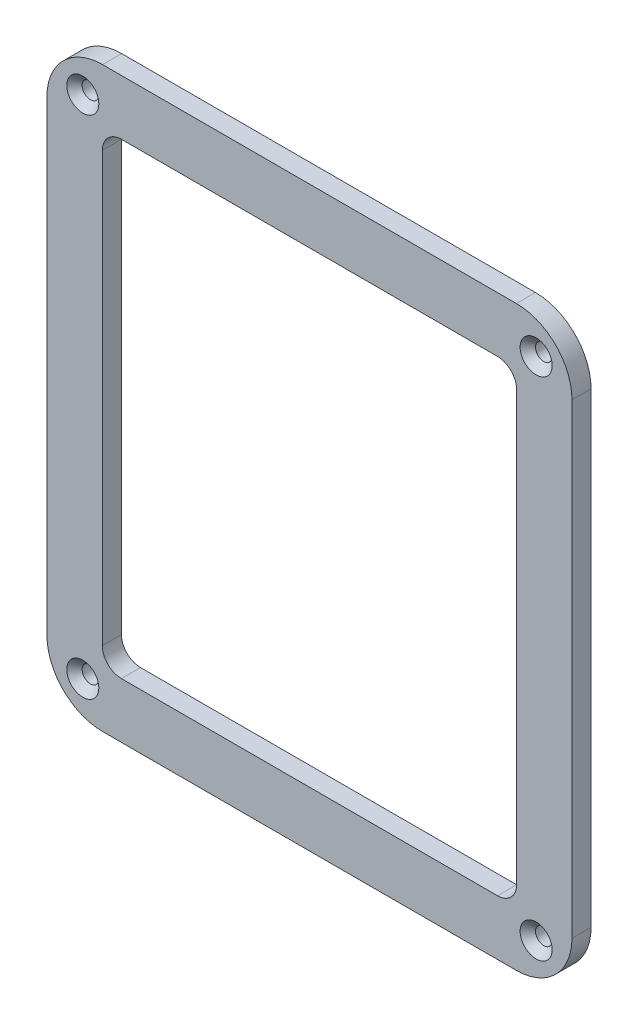
ISO-10303-21;
HEADER;
FILE_DESCRIPTION(('STEP AP214'),'2;1');
FILE_NAME('part.step','',(''),(''),'','','');
FILE_SCHEMA(('AUTOMOTIVE_DESIGN { 1 0 10303 214 1 1 1 1 }'));
ENDSEC;
DATA;
#1=APPLICATION_CONTEXT('core data for automotive mechanical design processes');
#2=APPLICATION_PROTOCOL_DEFINITION('international standard','automotive_design',2000,#1);
#3=PRODUCT_CONTEXT('',#1,'mechanical');
#4=PRODUCT('Part','Part','',(#3));
#5=PRODUCT_RELATED_PRODUCT_CATEGORY('part','',(#4));
#6=PRODUCT_DEFINITION_FORMATION('','',#4);
#7=PRODUCT_DEFINITION_CONTEXT('part definition',#1,'design');
#8=PRODUCT_DEFINITION('design','',#6,#7);
#9=PRODUCT_DEFINITION_SHAPE('','',#8);
#10=(LENGTH_UNIT() NAMED_UNIT(*) SI_UNIT(.MILLI.,.METRE.));
#11=(NAMED_UNIT(*) PLANE_ANGLE_UNIT() SI_UNIT($,.RADIAN.));
#12=(NAMED_UNIT(*) SI_UNIT($,.STERADIAN.) SOLID_ANGLE_UNIT());
#13=UNCERTAINTY_MEASURE_WITH_UNIT(LENGTH_MEASURE(1.E-05),#10,'distance_accuracy_value','');
#14=(GEOMETRIC_REPRESENTATION_CONTEXT(3) GLOBAL_UNCERTAINTY_ASSIGNED_CONTEXT((#13)) GLOBAL_UNIT_ASSIGNED_CONTEXT((#10,
#11,#12)) REPRESENTATION_CONTEXT('',''));
#15=CARTESIAN_POINT('',(0.,0.,0.));
#16=DIRECTION('',(0.,0.,1.));
#17=DIRECTION('',(1.,0.,0.));
#18=AXIS2_PLACEMENT_3D('',#15,#16,#17);
#19=CARTESIAN_POINT('',(43.35,48.85,4.));
#20=DIRECTION('',(0.,0.,1.));
#21=DIRECTION('',(1.,0.,0.));
#22=AXIS2_PLACEMENT_3D('',#19,#20,#21);
#23=PLANE('',#22);
#24=CARTESIAN_POINT('',(-47.4884406486747,-52.9884406486746,4.));
#25=DIRECTION('',(0.,0.,1.));
#26=DIRECTION('',(1.,0.,0.));
#27=AXIS2_PLACEMENT_3D('',#24,#25,#26);
#28=CIRCLE('',#27,3.36);
#29=CARTESIAN_POINT('',(-44.1284406486747,-52.9884406486746,4.));
#30=VERTEX_POINT('',#29);
#31=EDGE_CURVE('E665',#30,#30,#28,.T.);
#32=ORIENTED_EDGE('',*,*,#31,.F.);
#33=EDGE_LOOP('',(#32));
#34=FACE_BOUND('',#33,.T.);
#35=CARTESIAN_POINT('',(47.4884406486747,-52.9884406486746,4.));
#36=DIRECTION('',(0.,0.,1.));
#37=DIRECTION('',(1.,0.,0.));
#38=AXIS2_PLACEMENT_3D('',#35,#36,#37);
#39=CIRCLE('',#38,3.36);
#40=CARTESIAN_POINT('',(50.8484406486747,-52.9884406486746,4.));
#41=VERTEX_POINT('',#40);
#42=EDGE_CURVE('E442',#41,#41,#39,.T.);
#43=ORIENTED_EDGE('',*,*,#42,.F.);
#44=EDGE_LOOP('',(#43));
#45=FACE_BOUND('',#44,.T.);
#46=CARTESIAN_POINT('',(47.4884406486747,52.9884406486746,4.));
#47=DIRECTION('',(0.,0.,1.));
#48=DIRECTION('',(1.,0.,0.));
#49=AXIS2_PLACEMENT_3D('',#46,#47,#48);
#50=CIRCLE('',#49,3.36);
#51=CARTESIAN_POINT('',(50.8484406486747,52.9884406486746,4.));
#52=VERTEX_POINT('',#51);
#53=EDGE_CURVE('E432',#52,#52,#50,.T.);
#54=ORIENTED_EDGE('',*,*,#53,.F.);
#55=EDGE_LOOP('',(#54));
#56=FACE_BOUND('',#55,.T.);
#57=CARTESIAN_POINT('',(-47.4884406486747,52.9884406486746,4.));
#58=DIRECTION('',(0.,0.,1.));
#59=DIRECTION('',(1.,0.,0.));
#60=AXIS2_PLACEMENT_3D('',#57,#58,#59);
#61=CIRCLE('',#60,3.36);
#62=CARTESIAN_POINT('',(-44.1284406486747,52.9884406486746,4.));
#63=VERTEX_POINT('',#62);
#64=EDGE_CURVE('E429',#63,#63,#61,.T.);
#65=ORIENTED_EDGE('',*,*,#64,.F.);
#66=EDGE_LOOP('',(#65));
#67=FACE_BOUND('',#66,.T.);
#68=CARTESIAN_POINT('',(43.35,48.85,4.));
#69=DIRECTION('',(0.,0.,1.));
#70=DIRECTION('',(1.,0.,0.));
#71=AXIS2_PLACEMENT_3D('',#68,#69,#70);
#72=CIRCLE('',#71,11.65);
#73=CARTESIAN_POINT('',(55.,48.85,4.));
#74=VERTEX_POINT('',#73);
#75=CARTESIAN_POINT('',(43.35,60.5,4.));
#76=VERTEX_POINT('',#75);
#77=EDGE_CURVE('E373',#74,#76,#72,.T.);
#78=ORIENTED_EDGE('',*,*,#77,.T.);
#79=DIRECTION('',(-1.,0.,0.));
#80=VECTOR('',#79,1.);
#81=CARTESIAN_POINT('',(43.35,60.5,4.));
#82=LINE('',#81,#80);
#83=CARTESIAN_POINT('',(-43.35,60.5,4.));
#84=VERTEX_POINT('',#83);
#85=EDGE_CURVE('E376',#76,#84,#82,.T.);
#86=ORIENTED_EDGE('',*,*,#85,.T.);
#87=CARTESIAN_POINT('',(-43.35,48.85,4.));
#88=DIRECTION('',(0.,0.,1.));
#89=DIRECTION('',(1.,0.,0.));
#90=AXIS2_PLACEMENT_3D('',#87,#88,#89);
#91=CIRCLE('',#90,11.65);
#92=CARTESIAN_POINT('',(-55.,48.85,4.));
#93=VERTEX_POINT('',#92);
#94=EDGE_CURVE('E379',#84,#93,#91,.T.);
#95=ORIENTED_EDGE('',*,*,#94,.T.);
#96=DIRECTION('',(0.,-1.,0.));
#97=VECTOR('',#96,1.);
#98=CARTESIAN_POINT('',(-55.,-48.85,4.));
#99=LINE('',#98,#97);
#100=CARTESIAN_POINT('',(-55.,-48.85,4.));
#101=VERTEX_POINT('',#100);
#102=EDGE_CURVE('E381',#93,#101,#99,.T.);
#103=ORIENTED_EDGE('',*,*,#102,.T.);
#104=CARTESIAN_POINT('',(-43.35,-48.85,4.));
#105=DIRECTION('',(0.,0.,1.));
#106=DIRECTION('',(-1.,0.,0.));
#107=AXIS2_PLACEMENT_3D('',#104,#105,#106);
#108=CIRCLE('',#107,11.65);
#109=CARTESIAN_POINT('',(-43.35,-60.5,4.));
#110=VERTEX_POINT('',#109);
#111=EDGE_CURVE('E383',#101,#110,#108,.T.);
#112=ORIENTED_EDGE('',*,*,#111,.T.);
#113=DIRECTION('',(1.,0.,0.));
#114=VECTOR('',#113,1.);
#115=CARTESIAN_POINT('',(43.35,-60.5,4.));
#116=LINE('',#115,#114);
#117=CARTESIAN_POINT('',(43.35,-60.5,4.));
#118=VERTEX_POINT('',#117);
#119=EDGE_CURVE('E385',#110,#118,#116,.T.);
#120=ORIENTED_EDGE('',*,*,#119,.T.);
#121=CARTESIAN_POINT('',(43.35,-48.85,4.));
#122=DIRECTION('',(0.,0.,1.));
#123=DIRECTION('',(1.,0.,0.));
#124=AXIS2_PLACEMENT_3D('',#121,#122,#123);
#125=CIRCLE('',#124,11.65);
#126=CARTESIAN_POINT('',(55.,-48.85,4.));
#127=VERTEX_POINT('',#126);
#128=EDGE_CURVE('E387',#118,#127,#125,.T.);
#129=ORIENTED_EDGE('',*,*,#128,.T.);
#130=DIRECTION('',(0.,1.,0.));
#131=VECTOR('',#130,1.);
#132=CARTESIAN_POINT('',(55.,-48.85,4.));
#133=LINE('',#132,#131);
#134=EDGE_CURVE('E389',#127,#74,#133,.T.);
#135=ORIENTED_EDGE('',*,*,#134,.T.);
#136=EDGE_LOOP('',(#78,#86,#95,#103,#112,#120,#129,#135));
#137=FACE_BOUND('',#136,.T.);
#138=DIRECTION('',(-1.,0.,0.));
#139=VECTOR('',#138,1.);
#140=CARTESIAN_POINT('',(39.4,48.925,4.));
#141=LINE('',#140,#139);
#142=CARTESIAN_POINT('',(39.4,48.925,4.));
#143=VERTEX_POINT('',#142);
#144=CARTESIAN_POINT('',(-39.4,48.925,4.));
#145=VERTEX_POINT('',#144);
#146=EDGE_CURVE('E314',#143,#145,#141,.T.);
#147=ORIENTED_EDGE('',*,*,#146,.F.);
#148=CARTESIAN_POINT('',(39.4,44.925,4.));
#149=DIRECTION('',(0.,0.,1.));
#150=DIRECTION('',(1.,0.,0.));
#151=AXIS2_PLACEMENT_3D('',#148,#149,#150);
#152=CIRCLE('',#151,4.);
#153=CARTESIAN_POINT('',(43.4,44.925,4.));
#154=VERTEX_POINT('',#153);
#155=EDGE_CURVE('E306',#154,#143,#152,.T.);
#156=ORIENTED_EDGE('',*,*,#155,.F.);
#157=DIRECTION('',(0.,1.,0.));
#158=VECTOR('',#157,1.);
#159=CARTESIAN_POINT('',(43.4,-44.925,4.));
#160=LINE('',#159,#158);
#161=CARTESIAN_POINT('',(43.4,-44.925,4.));
#162=VERTEX_POINT('',#161);
#163=EDGE_CURVE('E340',#162,#154,#160,.T.);
#164=ORIENTED_EDGE('',*,*,#163,.F.);
#165=CARTESIAN_POINT('',(39.4,-44.925,4.));
#166=DIRECTION('',(0.,0.,1.));
#167=DIRECTION('',(1.,0.,0.));
#168=AXIS2_PLACEMENT_3D('',#165,#166,#167);
#169=CIRCLE('',#168,4.);
#170=CARTESIAN_POINT('',(39.4,-48.925,4.));
#171=VERTEX_POINT('',#170);
#172=EDGE_CURVE('E338',#171,#162,#169,.T.);
#173=ORIENTED_EDGE('',*,*,#172,.F.);
#174=DIRECTION('',(1.,0.,0.));
#175=VECTOR('',#174,1.);
#176=CARTESIAN_POINT('',(39.4,-48.925,4.));
#177=LINE('',#176,#175);
#178=CARTESIAN_POINT('',(-39.4,-48.925,4.));
#179=VERTEX_POINT('',#178);
#180=EDGE_CURVE('E336',#179,#171,#177,.T.);
#181=ORIENTED_EDGE('',*,*,#180,.F.);
#182=CARTESIAN_POINT('',(-39.4,-44.925,4.));
#183=DIRECTION('',(0.,0.,1.));
#184=DIRECTION('',(-1.,0.,0.));
#185=AXIS2_PLACEMENT_3D('',#182,#183,#184);
#186=CIRCLE('',#185,3.99999999999999);
#187=CARTESIAN_POINT('',(-43.4,-44.925,4.));
#188=VERTEX_POINT('',#187);
#189=EDGE_CURVE('E334',#188,#179,#186,.T.);
#190=ORIENTED_EDGE('',*,*,#189,.F.);
#191=DIRECTION('',(0.,-1.,0.));
#192=VECTOR('',#191,1.);
#193=CARTESIAN_POINT('',(-43.4,-44.925,4.));
#194=LINE('',#193,#192);
#195=CARTESIAN_POINT('',(-43.4,44.925,4.));
#196=VERTEX_POINT('',#195);
#197=EDGE_CURVE('E329',#196,#188,#194,.T.);
#198=ORIENTED_EDGE('',*,*,#197,.F.);
#199=CARTESIAN_POINT('',(-39.4,44.925,4.));
#200=DIRECTION('',(0.,0.,1.));
#201=DIRECTION('',(1.,0.,0.));
#202=AXIS2_PLACEMENT_3D('',#199,#200,#201);
#203=CIRCLE('',#202,4.);
#204=EDGE_CURVE('E327',#145,#196,#203,.T.);
#205=ORIENTED_EDGE('',*,*,#204,.F.);
#206=EDGE_LOOP('',(#147,#156,#164,#173,#181,#190,#198,#205));
#207=FACE_BOUND('',#206,.T.);
#208=ADVANCED_FACE('F191',(#34,#45,#56,#67,#137,#207),#23,.T.);
#209=CARTESIAN_POINT('',(43.35,48.85,0.));
#210=DIRECTION('',(0.,0.,1.));
#211=DIRECTION('',(1.,0.,0.));
#212=AXIS2_PLACEMENT_3D('',#209,#210,#211);
#213=PLANE('',#212);
#214=CARTESIAN_POINT('',(43.35,48.85,0.));
#215=DIRECTION('',(0.,0.,1.));
#216=DIRECTION('',(1.,0.,0.));
#217=AXIS2_PLACEMENT_3D('',#214,#215,#216);
#218=CIRCLE('',#217,11.65);
#219=CARTESIAN_POINT('',(55.,48.85,0.));
#220=VERTEX_POINT('',#219);
#221=CARTESIAN_POINT('',(43.35,60.5,0.));
#222=VERTEX_POINT('',#221);
#223=EDGE_CURVE('E322',#220,#222,#218,.T.);
#224=ORIENTED_EDGE('',*,*,#223,.F.);
#225=DIRECTION('',(0.,1.,0.));
#226=VECTOR('',#225,1.);
#227=CARTESIAN_POINT('',(55.,-48.85,0.));
#228=LINE('',#227,#226);
#229=CARTESIAN_POINT('',(55.,-48.85,0.));
#230=VERTEX_POINT('',#229);
#231=EDGE_CURVE('E377',#230,#220,#228,.T.);
#232=ORIENTED_EDGE('',*,*,#231,.F.);
#233=CARTESIAN_POINT('',(43.35,-48.85,0.));
#234=DIRECTION('',(0.,0.,1.));
#235=DIRECTION('',(1.,0.,0.));
#236=AXIS2_PLACEMENT_3D('',#233,#234,#235);
#237=CIRCLE('',#236,11.65);
#238=CARTESIAN_POINT('',(43.35,-60.5,0.));
#239=VERTEX_POINT('',#238);
#240=EDGE_CURVE('E404',#239,#230,#237,.T.);
#241=ORIENTED_EDGE('',*,*,#240,.F.);
#242=DIRECTION('',(1.,0.,0.));
#243=VECTOR('',#242,1.);
#244=CARTESIAN_POINT('',(43.35,-60.5,0.));
#245=LINE('',#244,#243);
#246=CARTESIAN_POINT('',(-43.35,-60.5,0.));
#247=VERTEX_POINT('',#246);
#248=EDGE_CURVE('E402',#247,#239,#245,.T.);
#249=ORIENTED_EDGE('',*,*,#248,.F.);
#250=CARTESIAN_POINT('',(-43.35,-48.85,0.));
#251=DIRECTION('',(0.,0.,1.));
#252=DIRECTION('',(-1.,0.,0.));
#253=AXIS2_PLACEMENT_3D('',#250,#251,#252);
#254=CIRCLE('',#253,11.65);
#255=CARTESIAN_POINT('',(-55.,-48.85,0.));
#256=VERTEX_POINT('',#255);
#257=EDGE_CURVE('E400',#256,#247,#254,.T.);
#258=ORIENTED_EDGE('',*,*,#257,.F.);
#259=DIRECTION('',(0.,-1.,0.));
#260=VECTOR('',#259,1.);
#261=CARTESIAN_POINT('',(-55.,-48.85,0.));
#262=LINE('',#261,#260);
#263=CARTESIAN_POINT('',(-55.,48.85,0.));
#264=VERTEX_POINT('',#263);
#265=EDGE_CURVE('E398',#264,#256,#262,.T.);
#266=ORIENTED_EDGE('',*,*,#265,.F.);
#267=CARTESIAN_POINT('',(-43.35,48.85,0.));
#268=DIRECTION('',(0.,0.,1.));
#269=DIRECTION('',(1.,0.,0.));
#270=AXIS2_PLACEMENT_3D('',#267,#268,#269);
#271=CIRCLE('',#270,11.65);
#272=CARTESIAN_POINT('',(-43.35,60.5,0.));
#273=VERTEX_POINT('',#272);
#274=EDGE_CURVE('E396',#273,#264,#271,.T.);
#275=ORIENTED_EDGE('',*,*,#274,.F.);
#276=DIRECTION('',(-1.,0.,0.));
#277=VECTOR('',#276,1.);
#278=CARTESIAN_POINT('',(43.35,60.5,0.));
#279=LINE('',#278,#277);
#280=EDGE_CURVE('E394',#222,#273,#279,.T.);
#281=ORIENTED_EDGE('',*,*,#280,.F.);
#282=EDGE_LOOP('',(#224,#232,#241,#249,#258,#266,#275,#281));
#283=FACE_BOUND('',#282,.T.);
#284=CARTESIAN_POINT('',(39.4,44.925,0.));
#285=DIRECTION('',(0.,0.,1.));
#286=DIRECTION('',(1.,0.,0.));
#287=AXIS2_PLACEMENT_3D('',#284,#285,#286);
#288=CIRCLE('',#287,4.);
#289=CARTESIAN_POINT('',(43.4,44.925,0.));
#290=VERTEX_POINT('',#289);
#291=CARTESIAN_POINT('',(39.4,48.925,0.));
#292=VERTEX_POINT('',#291);
#293=EDGE_CURVE('E216',#290,#292,#288,.T.);
#294=ORIENTED_EDGE('',*,*,#293,.T.);
#295=DIRECTION('',(-1.,0.,0.));
#296=VECTOR('',#295,1.);
#297=CARTESIAN_POINT('',(39.4,48.925,0.));
#298=LINE('',#297,#296);
#299=CARTESIAN_POINT('',(-39.4,48.925,0.));
#300=VERTEX_POINT('',#299);
#301=EDGE_CURVE('E321',#292,#300,#298,.T.);
#302=ORIENTED_EDGE('',*,*,#301,.T.);
#303=CARTESIAN_POINT('',(-39.4,44.925,0.));
#304=DIRECTION('',(0.,0.,1.));
#305=DIRECTION('',(1.,0.,0.));
#306=AXIS2_PLACEMENT_3D('',#303,#304,#305);
#307=CIRCLE('',#306,4.);
#308=CARTESIAN_POINT('',(-43.4,44.925,0.));
#309=VERTEX_POINT('',#308);
#310=EDGE_CURVE('E345',#300,#309,#307,.T.);
#311=ORIENTED_EDGE('',*,*,#310,.T.);
#312=DIRECTION('',(0.,-1.,0.));
#313=VECTOR('',#312,1.);
#314=CARTESIAN_POINT('',(-43.4,-44.925,0.));
#315=LINE('',#314,#313);
#316=CARTESIAN_POINT('',(-43.4,-44.925,0.));
#317=VERTEX_POINT('',#316);
#318=EDGE_CURVE('E348',#309,#317,#315,.T.);
#319=ORIENTED_EDGE('',*,*,#318,.T.);
#320=CARTESIAN_POINT('',(-39.4,-44.925,0.));
#321=DIRECTION('',(0.,0.,1.));
#322=DIRECTION('',(-1.,0.,0.));
#323=AXIS2_PLACEMENT_3D('',#320,#321,#322);
#324=CIRCLE('',#323,3.99999999999999);
#325=CARTESIAN_POINT('',(-39.4,-48.925,0.));
#326=VERTEX_POINT('',#325);
#327=EDGE_CURVE('E351',#317,#326,#324,.T.);
#328=ORIENTED_EDGE('',*,*,#327,.T.);
#329=DIRECTION('',(1.,0.,0.));
#330=VECTOR('',#329,1.);
#331=CARTESIAN_POINT('',(39.4,-48.925,0.));
#332=LINE('',#331,#330);
#333=CARTESIAN_POINT('',(39.4,-48.925,0.));
#334=VERTEX_POINT('',#333);
#335=EDGE_CURVE('E354',#326,#334,#332,.T.);
#336=ORIENTED_EDGE('',*,*,#335,.T.);
#337=CARTESIAN_POINT('',(39.4,-44.925,0.));
#338=DIRECTION('',(0.,0.,1.));
#339=DIRECTION('',(1.,0.,0.));
#340=AXIS2_PLACEMENT_3D('',#337,#338,#339);
#341=CIRCLE('',#340,4.);
#342=CARTESIAN_POINT('',(43.4,-44.925,0.));
#343=VERTEX_POINT('',#342);
#344=EDGE_CURVE('E357',#334,#343,#341,.T.);
#345=ORIENTED_EDGE('',*,*,#344,.T.);
#346=DIRECTION('',(0.,1.,0.));
#347=VECTOR('',#346,1.);
#348=CARTESIAN_POINT('',(43.4,-44.925,0.));
#349=LINE('',#348,#347);
#350=EDGE_CURVE('E315',#343,#290,#349,.T.);
#351=ORIENTED_EDGE('',*,*,#350,.T.);
#352=EDGE_LOOP('',(#294,#302,#311,#319,#328,#336,#345,#351));
#353=FACE_BOUND('',#352,.T.);
#354=CARTESIAN_POINT('',(47.4884406486747,52.9884406486746,0.));
#355=DIRECTION('',(0.,0.,1.));
#356=DIRECTION('',(-1.,0.,0.));
#357=AXIS2_PLACEMENT_3D('',#354,#355,#356);
#358=CIRCLE('',#357,1.75);
#359=CARTESIAN_POINT('',(45.7384406486747,52.9884406486746,0.));
#360=VERTEX_POINT('',#359);
#361=EDGE_CURVE('E343',#360,#360,#358,.T.);
#362=ORIENTED_EDGE('',*,*,#361,.T.);
#363=EDGE_LOOP('',(#362));
#364=FACE_BOUND('',#363,.T.);
#365=CARTESIAN_POINT('',(47.4884406486747,-52.9884406486746,0.));
#366=DIRECTION('',(0.,0.,1.));
#367=DIRECTION('',(1.,0.,0.));
#368=AXIS2_PLACEMENT_3D('',#365,#366,#367);
#369=CIRCLE('',#368,1.75);
#370=CARTESIAN_POINT('',(49.2384406486747,-52.9884406486746,0.));
#371=VERTEX_POINT('',#370);
#372=EDGE_CURVE('E451',#371,#371,#369,.T.);
#373=ORIENTED_EDGE('',*,*,#372,.T.);
#374=EDGE_LOOP('',(#373));
#375=FACE_BOUND('',#374,.T.);
#376=CARTESIAN_POINT('',(-47.4884406486747,52.9884406486746,0.));
#377=DIRECTION('',(0.,0.,1.));
#378=DIRECTION('',(1.,0.,0.));
#379=AXIS2_PLACEMENT_3D('',#376,#377,#378);
#380=CIRCLE('',#379,1.75);
#381=CARTESIAN_POINT('',(-45.7384406486747,52.9884406486746,0.));
#382=VERTEX_POINT('',#381);
#383=EDGE_CURVE('E448',#382,#382,#380,.T.);
#384=ORIENTED_EDGE('',*,*,#383,.T.);
#385=EDGE_LOOP('',(#384));
#386=FACE_BOUND('',#385,.T.);
#387=CARTESIAN_POINT('',(-47.4884406486747,-52.9884406486746,0.));
#388=DIRECTION('',(0.,0.,1.));
#389=DIRECTION('',(-1.,0.,0.));
#390=AXIS2_PLACEMENT_3D('',#387,#388,#389);
#391=CIRCLE('',#390,1.75);
#392=CARTESIAN_POINT('',(-49.2384406486747,-52.9884406486746,0.));
#393=VERTEX_POINT('',#392);
#394=EDGE_CURVE('E428',#393,#393,#391,.T.);
#395=ORIENTED_EDGE('',*,*,#394,.T.);
#396=EDGE_LOOP('',(#395));
#397=FACE_BOUND('',#396,.T.);
#398=ADVANCED_FACE('F456',(#283,#353,#364,#375,#386,#397),#213,.F.);
#399=CARTESIAN_POINT('',(43.35,48.85,4.));
#400=DIRECTION('',(0.,0.,-1.));
#401=DIRECTION('',(-1.,0.,0.));
#402=AXIS2_PLACEMENT_3D('',#399,#400,#401);
#403=CYLINDRICAL_SURFACE('',#402,11.65);
#404=ORIENTED_EDGE('',*,*,#223,.T.);
#405=DIRECTION('',(0.,0.,-1.));
#406=VECTOR('',#405,1.);
#407=CARTESIAN_POINT('',(43.35,60.5,4.));
#408=LINE('',#407,#406);
#409=EDGE_CURVE('E12',#76,#222,#408,.T.);
#410=ORIENTED_EDGE('',*,*,#409,.F.);
#411=ORIENTED_EDGE('',*,*,#77,.F.);
#412=DIRECTION('',(0.,0.,-1.));
#413=VECTOR('',#412,1.);
#414=CARTESIAN_POINT('',(55.,48.85,4.));
#415=LINE('',#414,#413);
#416=EDGE_CURVE('E391',#74,#220,#415,.T.);
#417=ORIENTED_EDGE('',*,*,#416,.T.);
#418=EDGE_LOOP('',(#404,#410,#411,#417));
#419=FACE_BOUND('',#418,.T.);
#420=ADVANCED_FACE('F193',(#419),#403,.T.);
#421=CARTESIAN_POINT('',(43.35,60.5,4.));
#422=DIRECTION('',(0.,-1.,0.));
#423=DIRECTION('',(1.,0.,0.));
#424=AXIS2_PLACEMENT_3D('',#421,#422,#423);
#425=PLANE('',#424);
#426=ORIENTED_EDGE('',*,*,#280,.T.);
#427=DIRECTION('',(0.,0.,-1.));
#428=VECTOR('',#427,1.);
#429=CARTESIAN_POINT('',(-43.35,60.5,4.));
#430=LINE('',#429,#428);
#431=EDGE_CURVE('E200',#84,#273,#430,.T.);
#432=ORIENTED_EDGE('',*,*,#431,.F.);
#433=ORIENTED_EDGE('',*,*,#85,.F.);
#434=ORIENTED_EDGE('',*,*,#409,.T.);
#435=EDGE_LOOP('',(#426,#432,#433,#434));
#436=FACE_BOUND('',#435,.T.);
#437=ADVANCED_FACE('F509',(#436),#425,.F.);
#438=CARTESIAN_POINT('',(-43.35,48.85,4.));
#439=DIRECTION('',(0.,0.,-1.));
#440=DIRECTION('',(-1.,0.,0.));
#441=AXIS2_PLACEMENT_3D('',#438,#439,#440);
#442=CYLINDRICAL_SURFACE('',#441,11.65);
#443=ORIENTED_EDGE('',*,*,#274,.T.);
#444=DIRECTION('',(0.,0.,-1.));
#445=VECTOR('',#444,1.);
#446=CARTESIAN_POINT('',(-55.,48.85,4.));
#447=LINE('',#446,#445);
#448=EDGE_CURVE('E421',#93,#264,#447,.T.);
#449=ORIENTED_EDGE('',*,*,#448,.F.);
#450=ORIENTED_EDGE('',*,*,#94,.F.);
#451=ORIENTED_EDGE('',*,*,#431,.T.);
#452=EDGE_LOOP('',(#443,#449,#450,#451));
#453=FACE_BOUND('',#452,.T.);
#454=ADVANCED_FACE('F506',(#453),#442,.T.);
#455=CARTESIAN_POINT('',(-55.,-48.85,4.));
#456=DIRECTION('',(1.,0.,0.));
#457=DIRECTION('',(0.,1.,0.));
#458=AXIS2_PLACEMENT_3D('',#455,#456,#457);
#459=PLANE('',#458);
#460=ORIENTED_EDGE('',*,*,#265,.T.);
#461=DIRECTION('',(0.,0.,-1.));
#462=VECTOR('',#461,1.);
#463=CARTESIAN_POINT('',(-55.,-48.85,4.));
#464=LINE('',#463,#462);
#465=EDGE_CURVE('E418',#101,#256,#464,.T.);
#466=ORIENTED_EDGE('',*,*,#465,.F.);
#467=ORIENTED_EDGE('',*,*,#102,.F.);
#468=ORIENTED_EDGE('',*,*,#448,.T.);
#469=EDGE_LOOP('',(#460,#466,#467,#468));
#470=FACE_BOUND('',#469,.T.);
#471=ADVANCED_FACE('F502',(#470),#459,.F.);
#472=CARTESIAN_POINT('',(-43.35,-48.85,4.));
#473=DIRECTION('',(0.,0.,-1.));
#474=DIRECTION('',(-1.,0.,0.));
#475=AXIS2_PLACEMENT_3D('',#472,#473,#474);
#476=CYLINDRICAL_SURFACE('',#475,11.65);
#477=ORIENTED_EDGE('',*,*,#257,.T.);
#478=DIRECTION('',(0.,0.,-1.));
#479=VECTOR('',#478,1.);
#480=CARTESIAN_POINT('',(-43.35,-60.5,4.));
#481=LINE('',#480,#479);
#482=EDGE_CURVE('E415',#110,#247,#481,.T.);
#483=ORIENTED_EDGE('',*,*,#482,.F.);
#484=ORIENTED_EDGE('',*,*,#111,.F.);
#485=ORIENTED_EDGE('',*,*,#465,.T.);
#486=EDGE_LOOP('',(#477,#483,#484,#485));
#487=FACE_BOUND('',#486,.T.);
#488=ADVANCED_FACE('F498',(#487),#476,.T.);
#489=CARTESIAN_POINT('',(43.35,-60.5,4.));
#490=DIRECTION('',(0.,1.,0.));
#491=DIRECTION('',(-1.,0.,0.));
#492=AXIS2_PLACEMENT_3D('',#489,#490,#491);
#493=PLANE('',#492);
#494=ORIENTED_EDGE('',*,*,#248,.T.);
#495=DIRECTION('',(0.,0.,-1.));
#496=VECTOR('',#495,1.);
#497=CARTESIAN_POINT('',(43.35,-60.5,4.));
#498=LINE('',#497,#496);
#499=EDGE_CURVE('E412',#118,#239,#498,.T.);
#500=ORIENTED_EDGE('',*,*,#499,.F.);
#501=ORIENTED_EDGE('',*,*,#119,.F.);
#502=ORIENTED_EDGE('',*,*,#482,.T.);
#503=EDGE_LOOP('',(#494,#500,#501,#502));
#504=FACE_BOUND('',#503,.T.);
#505=ADVANCED_FACE('F494',(#504),#493,.F.);
#506=CARTESIAN_POINT('',(43.35,-48.85,4.));
#507=DIRECTION('',(0.,0.,-1.));
#508=DIRECTION('',(-1.,0.,0.));
#509=AXIS2_PLACEMENT_3D('',#506,#507,#508);
#510=CYLINDRICAL_SURFACE('',#509,11.65);
#511=ORIENTED_EDGE('',*,*,#240,.T.);
#512=DIRECTION('',(0.,0.,-1.));
#513=VECTOR('',#512,1.);
#514=CARTESIAN_POINT('',(55.,-48.85,4.));
#515=LINE('',#514,#513);
#516=EDGE_CURVE('E409',#127,#230,#515,.T.);
#517=ORIENTED_EDGE('',*,*,#516,.F.);
#518=ORIENTED_EDGE('',*,*,#128,.F.);
#519=ORIENTED_EDGE('',*,*,#499,.T.);
#520=EDGE_LOOP('',(#511,#517,#518,#519));
#521=FACE_BOUND('',#520,.T.);
#522=ADVANCED_FACE('F490',(#521),#510,.T.);
#523=CARTESIAN_POINT('',(55.,-48.85,4.));
#524=DIRECTION('',(-1.,0.,0.));
#525=DIRECTION('',(0.,0.,1.));
#526=AXIS2_PLACEMENT_3D('',#523,#524,#525);
#527=PLANE('',#526);
#528=ORIENTED_EDGE('',*,*,#231,.T.);
#529=ORIENTED_EDGE('',*,*,#416,.F.);
#530=ORIENTED_EDGE('',*,*,#134,.F.);
#531=ORIENTED_EDGE('',*,*,#516,.T.);
#532=EDGE_LOOP('',(#528,#529,#530,#531));
#533=FACE_BOUND('',#532,.T.);
#534=ADVANCED_FACE('F487',(#533),#527,.F.);
#535=CARTESIAN_POINT('',(39.4,44.925,4.));
#536=DIRECTION('',(0.,0.,-1.));
#537=DIRECTION('',(-1.,0.,0.));
#538=AXIS2_PLACEMENT_3D('',#535,#536,#537);
#539=CYLINDRICAL_SURFACE('',#538,4.);
#540=ORIENTED_EDGE('',*,*,#293,.F.);
#541=DIRECTION('',(0.,0.,-1.));
#542=VECTOR('',#541,1.);
#543=CARTESIAN_POINT('',(43.4,44.925,4.));
#544=LINE('',#543,#542);
#545=EDGE_CURVE('E310',#154,#290,#544,.T.);
#546=ORIENTED_EDGE('',*,*,#545,.F.);
#547=ORIENTED_EDGE('',*,*,#155,.T.);
#548=DIRECTION('',(0.,0.,-1.));
#549=VECTOR('',#548,1.);
#550=CARTESIAN_POINT('',(39.4,48.925,4.));
#551=LINE('',#550,#549);
#552=EDGE_CURVE('E309',#143,#292,#551,.T.);
#553=ORIENTED_EDGE('',*,*,#552,.T.);
#554=EDGE_LOOP('',(#540,#546,#547,#553));
#555=FACE_BOUND('',#554,.T.);
#556=ADVANCED_FACE('F308',(#555),#539,.F.);
#557=CARTESIAN_POINT('',(39.4,48.925,4.));
#558=DIRECTION('',(0.,-1.,0.));
#559=DIRECTION('',(1.,0.,0.));
#560=AXIS2_PLACEMENT_3D('',#557,#558,#559);
#561=PLANE('',#560);
#562=ORIENTED_EDGE('',*,*,#301,.F.);
#563=ORIENTED_EDGE('',*,*,#552,.F.);
#564=ORIENTED_EDGE('',*,*,#146,.T.);
#565=DIRECTION('',(0.,0.,-1.));
#566=VECTOR('',#565,1.);
#567=CARTESIAN_POINT('',(-39.4,48.925,4.));
#568=LINE('',#567,#566);
#569=EDGE_CURVE('E323',#145,#300,#568,.T.);
#570=ORIENTED_EDGE('',*,*,#569,.T.);
#571=EDGE_LOOP('',(#562,#563,#564,#570));
#572=FACE_BOUND('',#571,.T.);
#573=ADVANCED_FACE('F318',(#572),#561,.T.);
#574=CARTESIAN_POINT('',(-39.4,44.925,4.));
#575=DIRECTION('',(0.,0.,-1.));
#576=DIRECTION('',(-1.,0.,0.));
#577=AXIS2_PLACEMENT_3D('',#574,#575,#576);
#578=CYLINDRICAL_SURFACE('',#577,4.);
#579=ORIENTED_EDGE('',*,*,#310,.F.);
#580=ORIENTED_EDGE('',*,*,#569,.F.);
#581=ORIENTED_EDGE('',*,*,#204,.T.);
#582=DIRECTION('',(0.,0.,-1.));
#583=VECTOR('',#582,1.);
#584=CARTESIAN_POINT('',(-43.4,44.925,4.));
#585=LINE('',#584,#583);
#586=EDGE_CURVE('E370',#196,#309,#585,.T.);
#587=ORIENTED_EDGE('',*,*,#586,.T.);
#588=EDGE_LOOP('',(#579,#580,#581,#587));
#589=FACE_BOUND('',#588,.T.);
#590=ADVANCED_FACE('F561',(#589),#578,.F.);
#591=CARTESIAN_POINT('',(-43.4,-44.925,4.));
#592=DIRECTION('',(1.,0.,0.));
#593=DIRECTION('',(0.,0.,-1.));
#594=AXIS2_PLACEMENT_3D('',#591,#592,#593);
#595=PLANE('',#594);
#596=ORIENTED_EDGE('',*,*,#318,.F.);
#597=ORIENTED_EDGE('',*,*,#586,.F.);
#598=ORIENTED_EDGE('',*,*,#197,.T.);
#599=DIRECTION('',(0.,0.,-1.));
#600=VECTOR('',#599,1.);
#601=CARTESIAN_POINT('',(-43.4,-44.925,4.));
#602=LINE('',#601,#600);
#603=EDGE_CURVE('E368',#188,#317,#602,.T.);
#604=ORIENTED_EDGE('',*,*,#603,.T.);
#605=EDGE_LOOP('',(#596,#597,#598,#604));
#606=FACE_BOUND('',#605,.T.);
#607=ADVANCED_FACE('F558',(#606),#595,.T.);
#608=CARTESIAN_POINT('',(-39.4,-44.925,4.));
#609=DIRECTION('',(0.,0.,-1.));
#610=DIRECTION('',(-1.,0.,0.));
#611=AXIS2_PLACEMENT_3D('',#608,#609,#610);
#612=CYLINDRICAL_SURFACE('',#611,3.99999999999999);
#613=ORIENTED_EDGE('',*,*,#327,.F.);
#614=ORIENTED_EDGE('',*,*,#603,.F.);
#615=ORIENTED_EDGE('',*,*,#189,.T.);
#616=DIRECTION('',(0.,0.,-1.));
#617=VECTOR('',#616,1.);
#618=CARTESIAN_POINT('',(-39.4,-48.925,4.));
#619=LINE('',#618,#617);
#620=EDGE_CURVE('E366',#179,#326,#619,.T.);
#621=ORIENTED_EDGE('',*,*,#620,.T.);
#622=EDGE_LOOP('',(#613,#614,#615,#621));
#623=FACE_BOUND('',#622,.T.);
#624=ADVANCED_FACE('F553',(#623),#612,.F.);
#625=CARTESIAN_POINT('',(39.4,-48.925,4.));
#626=DIRECTION('',(0.,1.,0.));
#627=DIRECTION('',(-1.,0.,0.));
#628=AXIS2_PLACEMENT_3D('',#625,#626,#627);
#629=PLANE('',#628);
#630=ORIENTED_EDGE('',*,*,#335,.F.);
#631=ORIENTED_EDGE('',*,*,#620,.F.);
#632=ORIENTED_EDGE('',*,*,#180,.T.);
#633=DIRECTION('',(0.,0.,-1.));
#634=VECTOR('',#633,1.);
#635=CARTESIAN_POINT('',(39.4,-48.925,4.));
#636=LINE('',#635,#634);
#637=EDGE_CURVE('E364',#171,#334,#636,.T.);
#638=ORIENTED_EDGE('',*,*,#637,.T.);
#639=EDGE_LOOP('',(#630,#631,#632,#638));
#640=FACE_BOUND('',#639,.T.);
#641=ADVANCED_FACE('F549',(#640),#629,.T.);
#642=CARTESIAN_POINT('',(39.4,-44.925,4.));
#643=DIRECTION('',(0.,0.,-1.));
#644=DIRECTION('',(-1.,0.,0.));
#645=AXIS2_PLACEMENT_3D('',#642,#643,#644);
#646=CYLINDRICAL_SURFACE('',#645,4.);
#647=ORIENTED_EDGE('',*,*,#344,.F.);
#648=ORIENTED_EDGE('',*,*,#637,.F.);
#649=ORIENTED_EDGE('',*,*,#172,.T.);
#650=DIRECTION('',(0.,0.,-1.));
#651=VECTOR('',#650,1.);
#652=CARTESIAN_POINT('',(43.4,-44.925,4.));
#653=LINE('',#652,#651);
#654=EDGE_CURVE('E208',#162,#343,#653,.T.);
#655=ORIENTED_EDGE('',*,*,#654,.T.);
#656=EDGE_LOOP('',(#647,#648,#649,#655));
#657=FACE_BOUND('',#656,.T.);
#658=ADVANCED_FACE('F472',(#657),#646,.F.);
#659=CARTESIAN_POINT('',(43.4,-44.925,4.));
#660=DIRECTION('',(-1.,0.,0.));
#661=DIRECTION('',(0.,-1.,0.));
#662=AXIS2_PLACEMENT_3D('',#659,#660,#661);
#663=PLANE('',#662);
#664=ORIENTED_EDGE('',*,*,#350,.F.);
#665=ORIENTED_EDGE('',*,*,#654,.F.);
#666=ORIENTED_EDGE('',*,*,#163,.T.);
#667=ORIENTED_EDGE('',*,*,#545,.T.);
#668=EDGE_LOOP('',(#664,#665,#666,#667));
#669=FACE_BOUND('',#668,.T.);
#670=ADVANCED_FACE('F462',(#669),#663,.T.);
#671=CARTESIAN_POINT('',(47.4884406486747,52.9884406486746,4.));
#672=DIRECTION('',(0.,0.,-1.));
#673=DIRECTION('',(-1.,0.,0.));
#674=AXIS2_PLACEMENT_3D('',#671,#672,#673);
#675=CYLINDRICAL_SURFACE('',#674,1.75);
#676=CARTESIAN_POINT('',(47.4884406486747,52.9884406486746,2.39));
#677=DIRECTION('',(0.,0.,1.));
#678=DIRECTION('',(1.,0.,0.));
#679=AXIS2_PLACEMENT_3D('',#676,#677,#678);
#680=CIRCLE('',#679,1.75);
#681=CARTESIAN_POINT('',(49.2384406486747,52.9884406486746,2.39));
#682=VERTEX_POINT('',#681);
#683=EDGE_CURVE('E430',#682,#682,#680,.F.);
#684=ORIENTED_EDGE('',*,*,#683,.F.);
#685=EDGE_LOOP('',(#684));
#686=FACE_BOUND('',#685,.T.);
#687=ORIENTED_EDGE('',*,*,#361,.F.);
#688=EDGE_LOOP('',(#687));
#689=FACE_BOUND('',#688,.T.);
#690=ADVANCED_FACE('F459',(#686,#689),#675,.F.);
#691=CARTESIAN_POINT('',(47.4884406486747,-52.9884406486746,4.));
#692=DIRECTION('',(0.,0.,-1.));
#693=DIRECTION('',(-1.,0.,0.));
#694=AXIS2_PLACEMENT_3D('',#691,#692,#693);
#695=CYLINDRICAL_SURFACE('',#694,1.75);
#696=CARTESIAN_POINT('',(47.4884406486747,-52.9884406486746,2.39));
#697=DIRECTION('',(0.,0.,1.));
#698=DIRECTION('',(1.,0.,0.));
#699=AXIS2_PLACEMENT_3D('',#696,#697,#698);
#700=CIRCLE('',#699,1.75);
#701=CARTESIAN_POINT('',(49.2384406486747,-52.9884406486746,2.39));
#702=VERTEX_POINT('',#701);
#703=EDGE_CURVE('E195',#702,#702,#700,.F.);
#704=ORIENTED_EDGE('',*,*,#703,.F.);
#705=EDGE_LOOP('',(#704));
#706=FACE_BOUND('',#705,.T.);
#707=ORIENTED_EDGE('',*,*,#372,.F.);
#708=EDGE_LOOP('',(#707));
#709=FACE_BOUND('',#708,.T.);
#710=ADVANCED_FACE('F461',(#706,#709),#695,.F.);
#711=CARTESIAN_POINT('',(-47.4884406486747,52.9884406486746,4.));
#712=DIRECTION('',(0.,0.,-1.));
#713=DIRECTION('',(-1.,0.,0.));
#714=AXIS2_PLACEMENT_3D('',#711,#712,#713);
#715=CYLINDRICAL_SURFACE('',#714,1.75);
#716=CARTESIAN_POINT('',(-47.4884406486747,52.9884406486746,2.39));
#717=DIRECTION('',(0.,0.,1.));
#718=DIRECTION('',(1.,0.,0.));
#719=AXIS2_PLACEMENT_3D('',#716,#717,#718);
#720=CIRCLE('',#719,1.75);
#721=CARTESIAN_POINT('',(-45.7384406486747,52.9884406486746,2.39));
#722=VERTEX_POINT('',#721);
#723=EDGE_CURVE('E426',#722,#722,#720,.F.);
#724=ORIENTED_EDGE('',*,*,#723,.F.);
#725=EDGE_LOOP('',(#724));
#726=FACE_BOUND('',#725,.T.);
#727=ORIENTED_EDGE('',*,*,#383,.F.);
#728=EDGE_LOOP('',(#727));
#729=FACE_BOUND('',#728,.T.);
#730=ADVANCED_FACE('F469',(#726,#729),#715,.F.);
#731=CARTESIAN_POINT('',(-47.4884406486747,-52.9884406486746,4.));
#732=DIRECTION('',(0.,0.,-1.));
#733=DIRECTION('',(-1.,0.,0.));
#734=AXIS2_PLACEMENT_3D('',#731,#732,#733);
#735=CYLINDRICAL_SURFACE('',#734,1.75);
#736=CARTESIAN_POINT('',(-47.4884406486747,-52.9884406486746,2.39));
#737=DIRECTION('',(0.,0.,1.));
#738=DIRECTION('',(1.,0.,0.));
#739=AXIS2_PLACEMENT_3D('',#736,#737,#738);
#740=CIRCLE('',#739,1.75);
#741=CARTESIAN_POINT('',(-45.7384406486747,-52.9884406486746,2.39));
#742=VERTEX_POINT('',#741);
#743=EDGE_CURVE('E663',#742,#742,#740,.F.);
#744=ORIENTED_EDGE('',*,*,#743,.F.);
#745=EDGE_LOOP('',(#744));
#746=FACE_BOUND('',#745,.T.);
#747=ORIENTED_EDGE('',*,*,#394,.F.);
#748=EDGE_LOOP('',(#747));
#749=FACE_BOUND('',#748,.T.);
#750=ADVANCED_FACE('F607',(#746,#749),#735,.F.);
#751=CARTESIAN_POINT('',(-47.4884406486747,52.9884406486746,4.));
#752=DIRECTION('',(0.,0.,1.));
#753=DIRECTION('',(1.,0.,0.));
#754=AXIS2_PLACEMENT_3D('',#751,#752,#753);
#755=CONICAL_SURFACE('',#754,3.36,0.785398163397448);
#756=ORIENTED_EDGE('',*,*,#723,.T.);
#757=EDGE_LOOP('',(#756));
#758=FACE_BOUND('',#757,.T.);
#759=ORIENTED_EDGE('',*,*,#64,.T.);
#760=EDGE_LOOP('',(#759));
#761=FACE_BOUND('',#760,.T.);
#762=ADVANCED_FACE('F617',(#758,#761),#755,.F.);
#763=CARTESIAN_POINT('',(47.4884406486747,52.9884406486746,4.));
#764=DIRECTION('',(0.,0.,1.));
#765=DIRECTION('',(1.,0.,0.));
#766=AXIS2_PLACEMENT_3D('',#763,#764,#765);
#767=CONICAL_SURFACE('',#766,3.36,0.785398163397448);
#768=ORIENTED_EDGE('',*,*,#683,.T.);
#769=EDGE_LOOP('',(#768));
#770=FACE_BOUND('',#769,.T.);
#771=ORIENTED_EDGE('',*,*,#53,.T.);
#772=EDGE_LOOP('',(#771));
#773=FACE_BOUND('',#772,.T.);
#774=ADVANCED_FACE('F627',(#770,#773),#767,.F.);
#775=CARTESIAN_POINT('',(47.4884406486747,-52.9884406486746,4.));
#776=DIRECTION('',(0.,0.,1.));
#777=DIRECTION('',(1.,0.,0.));
#778=AXIS2_PLACEMENT_3D('',#775,#776,#777);
#779=CONICAL_SURFACE('',#778,3.36,0.785398163397448);
#780=ORIENTED_EDGE('',*,*,#703,.T.);
#781=EDGE_LOOP('',(#780));
#782=FACE_BOUND('',#781,.T.);
#783=ORIENTED_EDGE('',*,*,#42,.T.);
#784=EDGE_LOOP('',(#783));
#785=FACE_BOUND('',#784,.T.);
#786=ADVANCED_FACE('F637',(#782,#785),#779,.F.);
#787=CARTESIAN_POINT('',(-47.4884406486747,-52.9884406486746,4.));
#788=DIRECTION('',(0.,0.,1.));
#789=DIRECTION('',(1.,0.,0.));
#790=AXIS2_PLACEMENT_3D('',#787,#788,#789);
#791=CONICAL_SURFACE('',#790,3.36,0.785398163397448);
#792=ORIENTED_EDGE('',*,*,#743,.T.);
#793=EDGE_LOOP('',(#792));
#794=FACE_BOUND('',#793,.T.);
#795=ORIENTED_EDGE('',*,*,#31,.T.);
#796=EDGE_LOOP('',(#795));
#797=FACE_BOUND('',#796,.T.);
#798=ADVANCED_FACE('F646',(#794,#797),#791,.F.);
#799=CLOSED_SHELL('',(#208,#398,#420,#437,#454,#471,#488,#505,#522,#534,#556,#573,#590,#607,
#624,#641,#658,#670,#690,#710,#730,#750,#762,#774,#786,#798));
#800=MANIFOLD_SOLID_BREP('B2',#799);
#801=ADVANCED_BREP_SHAPE_REPRESENTATION('',(#18,#800),#14);
#802=SHAPE_DEFINITION_REPRESENTATION(#9,#801);
ENDSEC;
END-ISO-10303-21;
